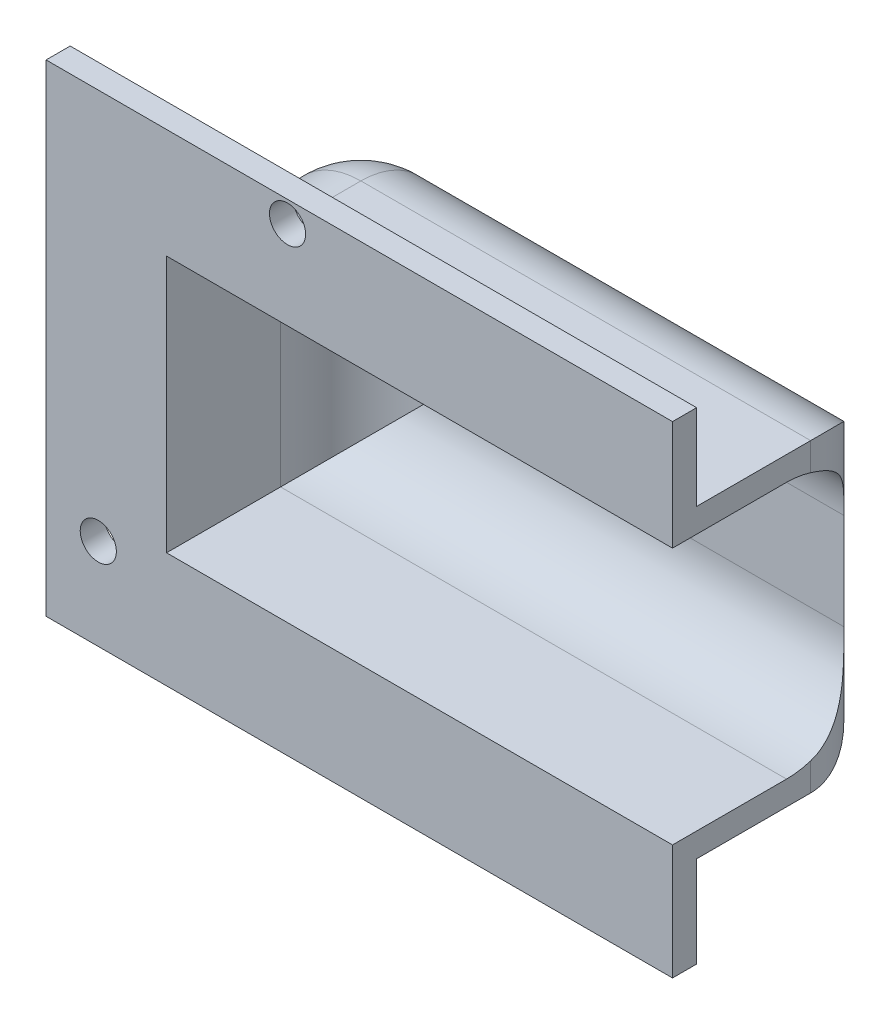
ISO-10303-21;
HEADER;
FILE_DESCRIPTION(('STEP AP214'),'2;1');
FILE_NAME('part.step','',(''),(''),'','','');
FILE_SCHEMA(('AUTOMOTIVE_DESIGN { 1 0 10303 214 1 1 1 1 }'));
ENDSEC;
DATA;
#1=APPLICATION_CONTEXT('core data for automotive mechanical design processes');
#2=APPLICATION_PROTOCOL_DEFINITION('international standard','automotive_design',2000,#1);
#3=PRODUCT_CONTEXT('',#1,'mechanical');
#4=PRODUCT('Part','Part','',(#3));
#5=PRODUCT_RELATED_PRODUCT_CATEGORY('part','',(#4));
#6=PRODUCT_DEFINITION_FORMATION('','',#4);
#7=PRODUCT_DEFINITION_CONTEXT('part definition',#1,'design');
#8=PRODUCT_DEFINITION('design','',#6,#7);
#9=PRODUCT_DEFINITION_SHAPE('','',#8);
#10=(LENGTH_UNIT() NAMED_UNIT(*) SI_UNIT(.MILLI.,.METRE.));
#11=(NAMED_UNIT(*) PLANE_ANGLE_UNIT() SI_UNIT($,.RADIAN.));
#12=(NAMED_UNIT(*) SI_UNIT($,.STERADIAN.) SOLID_ANGLE_UNIT());
#13=UNCERTAINTY_MEASURE_WITH_UNIT(LENGTH_MEASURE(1.E-05),#10,'distance_accuracy_value','');
#14=(GEOMETRIC_REPRESENTATION_CONTEXT(3) GLOBAL_UNCERTAINTY_ASSIGNED_CONTEXT((#13)) GLOBAL_UNIT_ASSIGNED_CONTEXT((#10,
#11,#12)) REPRESENTATION_CONTEXT('',''));
#15=CARTESIAN_POINT('',(0.,0.,0.));
#16=DIRECTION('',(0.,0.,1.));
#17=DIRECTION('',(1.,0.,0.));
#18=AXIS2_PLACEMENT_3D('',#15,#16,#17);
#19=CARTESIAN_POINT('',(33.,-16.,24.2));
#20=DIRECTION('',(-1.,0.,0.));
#21=DIRECTION('',(0.,-1.,0.));
#22=AXIS2_PLACEMENT_3D('',#19,#20,#21);
#23=PLANE('',#22);
#24=DIRECTION('',(0.,0.,-1.));
#25=VECTOR('',#24,1.);
#26=CARTESIAN_POINT('',(33.,-19.,24.2));
#27=LINE('',#26,#25);
#28=CARTESIAN_POINT('',(33.,-19.,21.2));
#29=VERTEX_POINT('',#28);
#30=CARTESIAN_POINT('',(33.,-19.,7.));
#31=VERTEX_POINT('',#30);
#32=EDGE_CURVE('E212',#29,#31,#27,.T.);
#33=ORIENTED_EDGE('',*,*,#32,.T.);
#34=DIRECTION('',(0.,1.,0.));
#35=VECTOR('',#34,1.);
#36=CARTESIAN_POINT('',(33.,19.,7.));
#37=LINE('',#36,#35);
#38=CARTESIAN_POINT('',(33.,-15.5393920141695,7.));
#39=VERTEX_POINT('',#38);
#40=EDGE_CURVE('E229',#31,#39,#37,.T.);
#41=ORIENTED_EDGE('',*,*,#40,.T.);
#42=CARTESIAN_POINT('',(33.,-6.,10.));
#43=DIRECTION('',(-1.,0.,0.));
#44=DIRECTION('',(0.,-1.,0.));
#45=AXIS2_PLACEMENT_3D('',#42,#43,#44);
#46=CIRCLE('',#45,10.);
#47=CARTESIAN_POINT('',(33.,-16.,10.));
#48=VERTEX_POINT('',#47);
#49=EDGE_CURVE('E388',#39,#48,#46,.T.);
#50=ORIENTED_EDGE('',*,*,#49,.T.);
#51=DIRECTION('',(0.,0.,1.));
#52=VECTOR('',#51,1.);
#53=CARTESIAN_POINT('',(33.,-16.,0.));
#54=LINE('',#53,#52);
#55=CARTESIAN_POINT('',(33.,-16.,24.2));
#56=VERTEX_POINT('',#55);
#57=EDGE_CURVE('E190',#48,#56,#54,.T.);
#58=ORIENTED_EDGE('',*,*,#57,.T.);
#59=DIRECTION('',(0.,1.,0.));
#60=VECTOR('',#59,1.);
#61=CARTESIAN_POINT('',(33.,0.,24.2));
#62=LINE('',#61,#60);
#63=CARTESIAN_POINT('',(33.,-30.3511171910625,24.2));
#64=VERTEX_POINT('',#63);
#65=EDGE_CURVE('E203',#64,#56,#62,.T.);
#66=ORIENTED_EDGE('',*,*,#65,.F.);
#67=DIRECTION('',(0.,0.,1.));
#68=VECTOR('',#67,1.);
#69=CARTESIAN_POINT('',(33.,-30.3511171910625,21.2));
#70=LINE('',#69,#68);
#71=CARTESIAN_POINT('',(33.,-30.3511171910625,21.2));
#72=VERTEX_POINT('',#71);
#73=EDGE_CURVE('E665',#72,#64,#70,.T.);
#74=ORIENTED_EDGE('',*,*,#73,.F.);
#75=DIRECTION('',(0.,1.,0.));
#76=VECTOR('',#75,1.);
#77=CARTESIAN_POINT('',(33.,0.,21.2));
#78=LINE('',#77,#76);
#79=EDGE_CURVE('E370',#72,#29,#78,.T.);
#80=ORIENTED_EDGE('',*,*,#79,.T.);
#81=EDGE_LOOP('',(#33,#41,#50,#58,#66,#74,#80));
#82=FACE_BOUND('',#81,.T.);
#83=ADVANCED_FACE('F41',(#82),#23,.F.);
#84=CARTESIAN_POINT('',(0.,0.,24.2));
#85=DIRECTION('',(0.,0.,-1.));
#86=DIRECTION('',(-1.,0.,0.));
#87=AXIS2_PLACEMENT_3D('',#84,#85,#86);
#88=PLANE('',#87);
#89=CARTESIAN_POINT('',(-14.9360679774998,27.,24.2));
#90=DIRECTION('',(0.,0.,-1.));
#91=DIRECTION('',(-1.,0.,0.));
#92=AXIS2_PLACEMENT_3D('',#89,#90,#91);
#93=CIRCLE('',#92,2.25000000000001);
#94=CARTESIAN_POINT('',(-17.1860679774998,27.,24.2));
#95=VERTEX_POINT('',#94);
#96=EDGE_CURVE('E200',#95,#95,#93,.T.);
#97=ORIENTED_EDGE('',*,*,#96,.T.);
#98=EDGE_LOOP('',(#97));
#99=FACE_BOUND('',#98,.T.);
#100=CARTESIAN_POINT('',(-38.5,-19.,24.2));
#101=DIRECTION('',(0.,0.,-1.));
#102=DIRECTION('',(-1.,0.,0.));
#103=AXIS2_PLACEMENT_3D('',#100,#101,#102);
#104=CIRCLE('',#103,2.25);
#105=CARTESIAN_POINT('',(-40.75,-19.,24.2));
#106=VERTEX_POINT('',#105);
#107=EDGE_CURVE('E244',#106,#106,#104,.T.);
#108=ORIENTED_EDGE('',*,*,#107,.T.);
#109=EDGE_LOOP('',(#108));
#110=FACE_BOUND('',#109,.T.);
#111=DIRECTION('',(-1.,0.,0.));
#112=VECTOR('',#111,1.);
#113=CARTESIAN_POINT('',(-30.,16.,24.2));
#114=LINE('',#113,#112);
#115=CARTESIAN_POINT('',(33.,16.,24.2));
#116=VERTEX_POINT('',#115);
#117=CARTESIAN_POINT('',(-30.,16.,24.2));
#118=VERTEX_POINT('',#117);
#119=EDGE_CURVE('E178',#116,#118,#114,.T.);
#120=ORIENTED_EDGE('',*,*,#119,.F.);
#121=CARTESIAN_POINT('',(33.,29.6488828089375,24.2));
#122=VERTEX_POINT('',#121);
#123=EDGE_CURVE('E195',#116,#122,#62,.T.);
#124=ORIENTED_EDGE('',*,*,#123,.T.);
#125=DIRECTION('',(-1.,0.,0.));
#126=VECTOR('',#125,1.);
#127=CARTESIAN_POINT('',(0.,29.6488828089375,24.2));
#128=LINE('',#127,#126);
#129=CARTESIAN_POINT('',(-45.,29.6488828089375,24.2));
#130=VERTEX_POINT('',#129);
#131=EDGE_CURVE('E673',#122,#130,#128,.T.);
#132=ORIENTED_EDGE('',*,*,#131,.T.);
#133=DIRECTION('',(0.,-1.,0.));
#134=VECTOR('',#133,1.);
#135=CARTESIAN_POINT('',(-45.,0.,24.2));
#136=LINE('',#135,#134);
#137=CARTESIAN_POINT('',(-45.,-30.3511171910625,24.2));
#138=VERTEX_POINT('',#137);
#139=EDGE_CURVE('E675',#130,#138,#136,.T.);
#140=ORIENTED_EDGE('',*,*,#139,.T.);
#141=DIRECTION('',(1.,0.,0.));
#142=VECTOR('',#141,1.);
#143=CARTESIAN_POINT('',(0.,-30.3511171910625,24.2));
#144=LINE('',#143,#142);
#145=EDGE_CURVE('E667',#138,#64,#144,.T.);
#146=ORIENTED_EDGE('',*,*,#145,.T.);
#147=ORIENTED_EDGE('',*,*,#65,.T.);
#148=DIRECTION('',(1.,0.,0.));
#149=VECTOR('',#148,1.);
#150=CARTESIAN_POINT('',(30.,-16.,24.2));
#151=LINE('',#150,#149);
#152=CARTESIAN_POINT('',(-30.,-16.,24.2));
#153=VERTEX_POINT('',#152);
#154=EDGE_CURVE('E659',#153,#56,#151,.T.);
#155=ORIENTED_EDGE('',*,*,#154,.F.);
#156=DIRECTION('',(0.,-1.,0.));
#157=VECTOR('',#156,1.);
#158=CARTESIAN_POINT('',(-30.,-16.,24.2));
#159=LINE('',#158,#157);
#160=EDGE_CURVE('E197',#118,#153,#159,.T.);
#161=ORIENTED_EDGE('',*,*,#160,.F.);
#162=EDGE_LOOP('',(#120,#124,#132,#140,#146,#147,#155,#161));
#163=FACE_BOUND('',#162,.T.);
#164=ADVANCED_FACE('F188',(#99,#110,#163),#88,.F.);
#165=CARTESIAN_POINT('',(30.,19.,24.2));
#166=DIRECTION('',(0.,-1.,0.));
#167=DIRECTION('',(0.,0.,-1.));
#168=AXIS2_PLACEMENT_3D('',#165,#166,#167);
#169=PLANE('',#168);
#170=DIRECTION('',(-1.,0.,0.));
#171=VECTOR('',#170,1.);
#172=CARTESIAN_POINT('',(-33.,19.,7.));
#173=LINE('',#172,#171);
#174=CARTESIAN_POINT('',(33.,19.,7.));
#175=VERTEX_POINT('',#174);
#176=CARTESIAN_POINT('',(-23.,19.,7.));
#177=VERTEX_POINT('',#176);
#178=EDGE_CURVE('E232',#175,#177,#173,.T.);
#179=ORIENTED_EDGE('',*,*,#178,.T.);
#180=DIRECTION('',(0.,0.,-1.));
#181=VECTOR('',#180,1.);
#182=CARTESIAN_POINT('',(-23.,19.,24.2));
#183=LINE('',#182,#181);
#184=CARTESIAN_POINT('',(-23.,19.,21.2));
#185=VERTEX_POINT('',#184);
#186=EDGE_CURVE('E61',#177,#185,#183,.F.);
#187=ORIENTED_EDGE('',*,*,#186,.T.);
#188=DIRECTION('',(-1.,0.,0.));
#189=VECTOR('',#188,1.);
#190=CARTESIAN_POINT('',(30.,19.,21.2));
#191=LINE('',#190,#189);
#192=CARTESIAN_POINT('',(33.,19.,21.2));
#193=VERTEX_POINT('',#192);
#194=EDGE_CURVE('E429',#193,#185,#191,.T.);
#195=ORIENTED_EDGE('',*,*,#194,.F.);
#196=DIRECTION('',(0.,0.,-1.));
#197=VECTOR('',#196,1.);
#198=CARTESIAN_POINT('',(33.,19.,24.2));
#199=LINE('',#198,#197);
#200=EDGE_CURVE('E210',#193,#175,#199,.T.);
#201=ORIENTED_EDGE('',*,*,#200,.T.);
#202=EDGE_LOOP('',(#179,#187,#195,#201));
#203=FACE_BOUND('',#202,.T.);
#204=ADVANCED_FACE('F315',(#203),#169,.F.);
#205=CARTESIAN_POINT('',(-33.,-16.,24.2));
#206=DIRECTION('',(1.,0.,0.));
#207=DIRECTION('',(0.,1.,0.));
#208=AXIS2_PLACEMENT_3D('',#205,#206,#207);
#209=PLANE('',#208);
#210=DIRECTION('',(0.,-1.,0.));
#211=VECTOR('',#210,1.);
#212=CARTESIAN_POINT('',(-33.,-16.,21.2));
#213=LINE('',#212,#211);
#214=CARTESIAN_POINT('',(-33.,9.,21.2));
#215=VERTEX_POINT('',#214);
#216=CARTESIAN_POINT('',(-33.,-9.,21.2));
#217=VERTEX_POINT('',#216);
#218=EDGE_CURVE('E649',#215,#217,#213,.T.);
#219=ORIENTED_EDGE('',*,*,#218,.F.);
#220=DIRECTION('',(0.,0.,-1.));
#221=VECTOR('',#220,1.);
#222=CARTESIAN_POINT('',(-33.,9.,24.2));
#223=LINE('',#222,#221);
#224=CARTESIAN_POINT('',(-33.,9.,7.));
#225=VERTEX_POINT('',#224);
#226=EDGE_CURVE('E402',#215,#225,#223,.T.);
#227=ORIENTED_EDGE('',*,*,#226,.T.);
#228=DIRECTION('',(0.,-1.,0.));
#229=VECTOR('',#228,1.);
#230=CARTESIAN_POINT('',(-33.,-19.,7.));
#231=LINE('',#230,#229);
#232=CARTESIAN_POINT('',(-33.,-9.,7.));
#233=VERTEX_POINT('',#232);
#234=EDGE_CURVE('E214',#225,#233,#231,.T.);
#235=ORIENTED_EDGE('',*,*,#234,.T.);
#236=DIRECTION('',(0.,0.,-1.));
#237=VECTOR('',#236,1.);
#238=CARTESIAN_POINT('',(-33.,-9.,24.2));
#239=LINE('',#238,#237);
#240=EDGE_CURVE('E397',#233,#217,#239,.F.);
#241=ORIENTED_EDGE('',*,*,#240,.T.);
#242=EDGE_LOOP('',(#219,#227,#235,#241));
#243=FACE_BOUND('',#242,.T.);
#244=ADVANCED_FACE('F308',(#243),#209,.F.);
#245=CARTESIAN_POINT('',(30.,-19.,24.2));
#246=DIRECTION('',(0.,1.,0.));
#247=DIRECTION('',(0.,0.,1.));
#248=AXIS2_PLACEMENT_3D('',#245,#246,#247);
#249=PLANE('',#248);
#250=DIRECTION('',(1.,0.,0.));
#251=VECTOR('',#250,1.);
#252=CARTESIAN_POINT('',(30.,-19.,21.2));
#253=LINE('',#252,#251);
#254=CARTESIAN_POINT('',(-23.,-19.,21.2));
#255=VERTEX_POINT('',#254);
#256=EDGE_CURVE('E646',#255,#29,#253,.T.);
#257=ORIENTED_EDGE('',*,*,#256,.F.);
#258=DIRECTION('',(0.,0.,-1.));
#259=VECTOR('',#258,1.);
#260=CARTESIAN_POINT('',(-23.,-19.,24.2));
#261=LINE('',#260,#259);
#262=CARTESIAN_POINT('',(-23.,-19.,7.));
#263=VERTEX_POINT('',#262);
#264=EDGE_CURVE('E404',#255,#263,#261,.T.);
#265=ORIENTED_EDGE('',*,*,#264,.T.);
#266=DIRECTION('',(1.,0.,0.));
#267=VECTOR('',#266,1.);
#268=CARTESIAN_POINT('',(33.,-19.,7.));
#269=LINE('',#268,#267);
#270=EDGE_CURVE('E228',#263,#31,#269,.T.);
#271=ORIENTED_EDGE('',*,*,#270,.T.);
#272=ORIENTED_EDGE('',*,*,#32,.F.);
#273=EDGE_LOOP('',(#257,#265,#271,#272));
#274=FACE_BOUND('',#273,.T.);
#275=ADVANCED_FACE('F304',(#274),#249,.F.);
#276=CARTESIAN_POINT('',(30.,16.,24.2));
#277=DIRECTION('',(0.,-1.,0.));
#278=DIRECTION('',(0.,0.,-1.));
#279=AXIS2_PLACEMENT_3D('',#276,#277,#278);
#280=PLANE('',#279);
#281=DIRECTION('',(0.,0.,-1.));
#282=VECTOR('',#281,1.);
#283=CARTESIAN_POINT('',(-30.,16.,24.2));
#284=LINE('',#283,#282);
#285=CARTESIAN_POINT('',(-30.,16.,10.));
#286=VERTEX_POINT('',#285);
#287=EDGE_CURVE('E202',#118,#286,#284,.T.);
#288=ORIENTED_EDGE('',*,*,#287,.T.);
#289=DIRECTION('',(-1.,0.,0.));
#290=VECTOR('',#289,1.);
#291=CARTESIAN_POINT('',(30.,16.,10.));
#292=LINE('',#291,#290);
#293=CARTESIAN_POINT('',(33.,16.,10.));
#294=VERTEX_POINT('',#293);
#295=EDGE_CURVE('E181',#286,#294,#292,.F.);
#296=ORIENTED_EDGE('',*,*,#295,.T.);
#297=DIRECTION('',(0.,0.,1.));
#298=VECTOR('',#297,1.);
#299=CARTESIAN_POINT('',(33.,16.,0.));
#300=LINE('',#299,#298);
#301=EDGE_CURVE('E172',#294,#116,#300,.T.);
#302=ORIENTED_EDGE('',*,*,#301,.T.);
#303=ORIENTED_EDGE('',*,*,#119,.T.);
#304=EDGE_LOOP('',(#288,#296,#302,#303));
#305=FACE_BOUND('',#304,.T.);
#306=ADVANCED_FACE('F180',(#305),#280,.T.);
#307=CARTESIAN_POINT('',(-30.,-16.,24.2));
#308=DIRECTION('',(1.,0.,0.));
#309=DIRECTION('',(0.,1.,0.));
#310=AXIS2_PLACEMENT_3D('',#307,#308,#309);
#311=PLANE('',#310);
#312=DIRECTION('',(0.,0.,-1.));
#313=VECTOR('',#312,1.);
#314=CARTESIAN_POINT('',(-30.,-16.,24.2));
#315=LINE('',#314,#313);
#316=CARTESIAN_POINT('',(-30.,-16.,10.));
#317=VERTEX_POINT('',#316);
#318=EDGE_CURVE('E187',#153,#317,#315,.T.);
#319=ORIENTED_EDGE('',*,*,#318,.T.);
#320=DIRECTION('',(0.,-1.,0.));
#321=VECTOR('',#320,1.);
#322=CARTESIAN_POINT('',(-30.,-16.,10.));
#323=LINE('',#322,#321);
#324=EDGE_CURVE('E254',#317,#286,#323,.F.);
#325=ORIENTED_EDGE('',*,*,#324,.T.);
#326=ORIENTED_EDGE('',*,*,#287,.F.);
#327=ORIENTED_EDGE('',*,*,#160,.T.);
#328=EDGE_LOOP('',(#319,#325,#326,#327));
#329=FACE_BOUND('',#328,.T.);
#330=ADVANCED_FACE('F322',(#329),#311,.T.);
#331=CARTESIAN_POINT('',(30.,-16.,24.2));
#332=DIRECTION('',(0.,1.,0.));
#333=DIRECTION('',(0.,0.,1.));
#334=AXIS2_PLACEMENT_3D('',#331,#332,#333);
#335=PLANE('',#334);
#336=ORIENTED_EDGE('',*,*,#57,.F.);
#337=DIRECTION('',(1.,0.,0.));
#338=VECTOR('',#337,1.);
#339=CARTESIAN_POINT('',(30.,-16.,10.));
#340=LINE('',#339,#338);
#341=EDGE_CURVE('E253',#48,#317,#340,.F.);
#342=ORIENTED_EDGE('',*,*,#341,.T.);
#343=ORIENTED_EDGE('',*,*,#318,.F.);
#344=ORIENTED_EDGE('',*,*,#154,.T.);
#345=EDGE_LOOP('',(#336,#342,#343,#344));
#346=FACE_BOUND('',#345,.T.);
#347=ADVANCED_FACE('F302',(#346),#335,.T.);
#348=ORIENTED_EDGE('',*,*,#301,.F.);
#349=CARTESIAN_POINT('',(33.,6.,10.));
#350=DIRECTION('',(-1.,0.,0.));
#351=DIRECTION('',(0.,-1.,0.));
#352=AXIS2_PLACEMENT_3D('',#349,#350,#351);
#353=CIRCLE('',#352,10.);
#354=CARTESIAN_POINT('',(33.,15.5393920141695,7.));
#355=VERTEX_POINT('',#354);
#356=EDGE_CURVE('E260',#294,#355,#353,.T.);
#357=ORIENTED_EDGE('',*,*,#356,.T.);
#358=DIRECTION('',(0.,1.,0.));
#359=VECTOR('',#358,1.);
#360=CARTESIAN_POINT('',(33.,19.,7.));
#361=LINE('',#360,#359);
#362=EDGE_CURVE('E226',#355,#175,#361,.T.);
#363=ORIENTED_EDGE('',*,*,#362,.T.);
#364=ORIENTED_EDGE('',*,*,#200,.F.);
#365=CARTESIAN_POINT('',(33.,29.6488828089375,21.2));
#366=VERTEX_POINT('',#365);
#367=EDGE_CURVE('E689',#193,#366,#78,.T.);
#368=ORIENTED_EDGE('',*,*,#367,.T.);
#369=DIRECTION('',(0.,0.,1.));
#370=VECTOR('',#369,1.);
#371=CARTESIAN_POINT('',(33.,29.6488828089375,21.2));
#372=LINE('',#371,#370);
#373=EDGE_CURVE('E201',#366,#122,#372,.T.);
#374=ORIENTED_EDGE('',*,*,#373,.T.);
#375=ORIENTED_EDGE('',*,*,#123,.F.);
#376=EDGE_LOOP('',(#348,#357,#363,#364,#368,#374,#375));
#377=FACE_BOUND('',#376,.T.);
#378=ADVANCED_FACE('F196',(#377),#23,.F.);
#379=CARTESIAN_POINT('',(0.,0.,-3.));
#380=DIRECTION('',(0.,0.,-1.));
#381=DIRECTION('',(-1.,0.,0.));
#382=AXIS2_PLACEMENT_3D('',#379,#380,#381);
#383=PLANE('',#382);
#384=DIRECTION('',(1.,0.,0.));
#385=VECTOR('',#384,1.);
#386=CARTESIAN_POINT('',(-33.,-9.,-3.));
#387=LINE('',#386,#385);
#388=CARTESIAN_POINT('',(23.,-9.,-3.));
#389=VERTEX_POINT('',#388);
#390=CARTESIAN_POINT('',(-23.,-9.,-3.));
#391=VERTEX_POINT('',#390);
#392=EDGE_CURVE('E219',#389,#391,#387,.F.);
#393=ORIENTED_EDGE('',*,*,#392,.T.);
#394=DIRECTION('',(0.,-1.,0.));
#395=VECTOR('',#394,1.);
#396=CARTESIAN_POINT('',(-23.,19.,-3.));
#397=LINE('',#396,#395);
#398=CARTESIAN_POINT('',(-23.,9.,-3.));
#399=VERTEX_POINT('',#398);
#400=EDGE_CURVE('E223',#391,#399,#397,.F.);
#401=ORIENTED_EDGE('',*,*,#400,.T.);
#402=DIRECTION('',(-1.,0.,0.));
#403=VECTOR('',#402,1.);
#404=CARTESIAN_POINT('',(33.,9.,-3.));
#405=LINE('',#404,#403);
#406=CARTESIAN_POINT('',(23.,9.,-3.));
#407=VERTEX_POINT('',#406);
#408=EDGE_CURVE('E216',#399,#407,#405,.F.);
#409=ORIENTED_EDGE('',*,*,#408,.T.);
#410=DIRECTION('',(0.,1.,0.));
#411=VECTOR('',#410,1.);
#412=CARTESIAN_POINT('',(23.,-19.,-3.));
#413=LINE('',#412,#411);
#414=EDGE_CURVE('E218',#407,#389,#413,.F.);
#415=ORIENTED_EDGE('',*,*,#414,.T.);
#416=EDGE_LOOP('',(#393,#401,#409,#415));
#417=FACE_BOUND('',#416,.T.);
#418=ADVANCED_FACE('F300',(#417),#383,.T.);
#419=CARTESIAN_POINT('',(0.,0.,0.));
#420=DIRECTION('',(0.,0.,-1.));
#421=DIRECTION('',(-1.,0.,0.));
#422=AXIS2_PLACEMENT_3D('',#419,#420,#421);
#423=PLANE('',#422);
#424=DIRECTION('',(0.,-1.,0.));
#425=VECTOR('',#424,1.);
#426=CARTESIAN_POINT('',(30.1414284285429,-16.,0.));
#427=LINE('',#426,#425);
#428=CARTESIAN_POINT('',(30.1414284285429,-6.,0.));
#429=VERTEX_POINT('',#428);
#430=CARTESIAN_POINT('',(30.1414284285429,6.,0.));
#431=VERTEX_POINT('',#430);
#432=EDGE_CURVE('E235',#429,#431,#427,.F.);
#433=ORIENTED_EDGE('',*,*,#432,.T.);
#434=DIRECTION('',(-1.,0.,0.));
#435=VECTOR('',#434,1.);
#436=CARTESIAN_POINT('',(0.,6.,0.));
#437=LINE('',#436,#435);
#438=CARTESIAN_POINT('',(-20.,6.,0.));
#439=VERTEX_POINT('',#438);
#440=EDGE_CURVE('E248',#431,#439,#437,.T.);
#441=ORIENTED_EDGE('',*,*,#440,.T.);
#442=DIRECTION('',(0.,-1.,0.));
#443=VECTOR('',#442,1.);
#444=CARTESIAN_POINT('',(-20.,0.,0.));
#445=LINE('',#444,#443);
#446=CARTESIAN_POINT('',(-20.,-6.,0.));
#447=VERTEX_POINT('',#446);
#448=EDGE_CURVE('E250',#439,#447,#445,.T.);
#449=ORIENTED_EDGE('',*,*,#448,.T.);
#450=DIRECTION('',(1.,0.,0.));
#451=VECTOR('',#450,1.);
#452=CARTESIAN_POINT('',(0.,-6.,0.));
#453=LINE('',#452,#451);
#454=EDGE_CURVE('E240',#447,#429,#453,.T.);
#455=ORIENTED_EDGE('',*,*,#454,.T.);
#456=EDGE_LOOP('',(#433,#441,#449,#455));
#457=FACE_BOUND('',#456,.T.);
#458=ADVANCED_FACE('F297',(#457),#423,.F.);
#459=CARTESIAN_POINT('',(0.,0.,21.2));
#460=DIRECTION('',(0.,0.,1.));
#461=DIRECTION('',(1.,0.,0.));
#462=AXIS2_PLACEMENT_3D('',#459,#460,#461);
#463=PLANE('',#462);
#464=CARTESIAN_POINT('',(-14.9360679774998,27.,21.2));
#465=DIRECTION('',(0.,0.,-1.));
#466=DIRECTION('',(-1.,0.,0.));
#467=AXIS2_PLACEMENT_3D('',#464,#465,#466);
#468=CIRCLE('',#467,2.25000000000001);
#469=CARTESIAN_POINT('',(-17.1860679774998,27.,21.2));
#470=VERTEX_POINT('',#469);
#471=EDGE_CURVE('E697',#470,#470,#468,.T.);
#472=ORIENTED_EDGE('',*,*,#471,.F.);
#473=EDGE_LOOP('',(#472));
#474=FACE_BOUND('',#473,.T.);
#475=CARTESIAN_POINT('',(-38.5,-19.,21.2));
#476=DIRECTION('',(0.,0.,-1.));
#477=DIRECTION('',(-1.,0.,0.));
#478=AXIS2_PLACEMENT_3D('',#475,#476,#477);
#479=CIRCLE('',#478,2.25);
#480=CARTESIAN_POINT('',(-40.75,-19.,21.2));
#481=VERTEX_POINT('',#480);
#482=EDGE_CURVE('E696',#481,#481,#479,.T.);
#483=ORIENTED_EDGE('',*,*,#482,.F.);
#484=EDGE_LOOP('',(#483));
#485=FACE_BOUND('',#484,.T.);
#486=ORIENTED_EDGE('',*,*,#367,.F.);
#487=ORIENTED_EDGE('',*,*,#194,.T.);
#488=CARTESIAN_POINT('',(-23.,9.,21.2));
#489=DIRECTION('',(0.,0.,1.));
#490=DIRECTION('',(1.,0.,0.));
#491=AXIS2_PLACEMENT_3D('',#488,#489,#490);
#492=CIRCLE('',#491,10.);
#493=EDGE_CURVE('E49',#185,#215,#492,.T.);
#494=ORIENTED_EDGE('',*,*,#493,.T.);
#495=ORIENTED_EDGE('',*,*,#218,.T.);
#496=CARTESIAN_POINT('',(-23.,-9.,21.2));
#497=DIRECTION('',(0.,0.,1.));
#498=DIRECTION('',(1.,0.,0.));
#499=AXIS2_PLACEMENT_3D('',#496,#497,#498);
#500=CIRCLE('',#499,10.);
#501=EDGE_CURVE('E11',#217,#255,#500,.T.);
#502=ORIENTED_EDGE('',*,*,#501,.T.);
#503=ORIENTED_EDGE('',*,*,#256,.T.);
#504=ORIENTED_EDGE('',*,*,#79,.F.);
#505=DIRECTION('',(1.,0.,0.));
#506=VECTOR('',#505,1.);
#507=CARTESIAN_POINT('',(0.,-30.3511171910625,21.2));
#508=LINE('',#507,#506);
#509=CARTESIAN_POINT('',(-45.,-30.3511171910625,21.2));
#510=VERTEX_POINT('',#509);
#511=EDGE_CURVE('E666',#510,#72,#508,.T.);
#512=ORIENTED_EDGE('',*,*,#511,.F.);
#513=DIRECTION('',(0.,-1.,0.));
#514=VECTOR('',#513,1.);
#515=CARTESIAN_POINT('',(-45.,0.,21.2));
#516=LINE('',#515,#514);
#517=CARTESIAN_POINT('',(-45.,29.6488828089375,21.2));
#518=VERTEX_POINT('',#517);
#519=EDGE_CURVE('E668',#518,#510,#516,.T.);
#520=ORIENTED_EDGE('',*,*,#519,.F.);
#521=DIRECTION('',(-1.,0.,0.));
#522=VECTOR('',#521,1.);
#523=CARTESIAN_POINT('',(0.,29.6488828089375,21.2));
#524=LINE('',#523,#522);
#525=EDGE_CURVE('E688',#366,#518,#524,.T.);
#526=ORIENTED_EDGE('',*,*,#525,.F.);
#527=EDGE_LOOP('',(#486,#487,#494,#495,#502,#503,#504,#512,#520,#526));
#528=FACE_BOUND('',#527,.T.);
#529=ADVANCED_FACE('F328',(#474,#485,#528),#463,.F.);
#530=CARTESIAN_POINT('',(0.,-30.3511171910625,21.2));
#531=DIRECTION('',(0.,-1.,0.));
#532=DIRECTION('',(0.,0.,-1.));
#533=AXIS2_PLACEMENT_3D('',#530,#531,#532);
#534=PLANE('',#533);
#535=ORIENTED_EDGE('',*,*,#145,.F.);
#536=DIRECTION('',(0.,0.,1.));
#537=VECTOR('',#536,1.);
#538=CARTESIAN_POINT('',(-45.,-30.3511171910625,21.2));
#539=LINE('',#538,#537);
#540=EDGE_CURVE('E655',#510,#138,#539,.T.);
#541=ORIENTED_EDGE('',*,*,#540,.F.);
#542=ORIENTED_EDGE('',*,*,#511,.T.);
#543=ORIENTED_EDGE('',*,*,#73,.T.);
#544=EDGE_LOOP('',(#535,#541,#542,#543));
#545=FACE_BOUND('',#544,.T.);
#546=ADVANCED_FACE('F335',(#545),#534,.T.);
#547=CARTESIAN_POINT('',(-45.,0.,21.2));
#548=DIRECTION('',(-1.,0.,0.));
#549=DIRECTION('',(0.,0.,1.));
#550=AXIS2_PLACEMENT_3D('',#547,#548,#549);
#551=PLANE('',#550);
#552=ORIENTED_EDGE('',*,*,#139,.F.);
#553=DIRECTION('',(0.,0.,1.));
#554=VECTOR('',#553,1.);
#555=CARTESIAN_POINT('',(-45.,29.6488828089375,21.2));
#556=LINE('',#555,#554);
#557=EDGE_CURVE('E682',#518,#130,#556,.T.);
#558=ORIENTED_EDGE('',*,*,#557,.F.);
#559=ORIENTED_EDGE('',*,*,#519,.T.);
#560=ORIENTED_EDGE('',*,*,#540,.T.);
#561=EDGE_LOOP('',(#552,#558,#559,#560));
#562=FACE_BOUND('',#561,.T.);
#563=ADVANCED_FACE('F334',(#562),#551,.T.);
#564=CARTESIAN_POINT('',(0.,29.6488828089375,21.2));
#565=DIRECTION('',(0.,1.,0.));
#566=DIRECTION('',(0.,0.,1.));
#567=AXIS2_PLACEMENT_3D('',#564,#565,#566);
#568=PLANE('',#567);
#569=ORIENTED_EDGE('',*,*,#131,.F.);
#570=ORIENTED_EDGE('',*,*,#373,.F.);
#571=ORIENTED_EDGE('',*,*,#525,.T.);
#572=ORIENTED_EDGE('',*,*,#557,.T.);
#573=EDGE_LOOP('',(#569,#570,#571,#572));
#574=FACE_BOUND('',#573,.T.);
#575=ADVANCED_FACE('F340',(#574),#568,.T.);
#576=CARTESIAN_POINT('',(-38.5,-19.,24.2));
#577=DIRECTION('',(0.,0.,-1.));
#578=DIRECTION('',(-1.,0.,0.));
#579=AXIS2_PLACEMENT_3D('',#576,#577,#578);
#580=CYLINDRICAL_SURFACE('',#579,2.25);
#581=ORIENTED_EDGE('',*,*,#107,.F.);
#582=EDGE_LOOP('',(#581));
#583=FACE_BOUND('',#582,.T.);
#584=ORIENTED_EDGE('',*,*,#482,.T.);
#585=EDGE_LOOP('',(#584));
#586=FACE_BOUND('',#585,.T.);
#587=ADVANCED_FACE('F338',(#583,#586),#580,.F.);
#588=CARTESIAN_POINT('',(-14.9360679774998,27.,24.2));
#589=DIRECTION('',(0.,0.,-1.));
#590=DIRECTION('',(-1.,0.,0.));
#591=AXIS2_PLACEMENT_3D('',#588,#589,#590);
#592=CYLINDRICAL_SURFACE('',#591,2.25000000000001);
#593=ORIENTED_EDGE('',*,*,#96,.F.);
#594=EDGE_LOOP('',(#593));
#595=FACE_BOUND('',#594,.T.);
#596=ORIENTED_EDGE('',*,*,#471,.T.);
#597=EDGE_LOOP('',(#596));
#598=FACE_BOUND('',#597,.T.);
#599=ADVANCED_FACE('F285',(#595,#598),#592,.F.);
#600=CARTESIAN_POINT('',(23.,-16.,7.));
#601=DIRECTION('',(0.,-1.,0.));
#602=DIRECTION('',(1.,0.,0.));
#603=AXIS2_PLACEMENT_3D('',#600,#601,#602);
#604=CYLINDRICAL_SURFACE('',#603,10.);
#605=CARTESIAN_POINT('',(23.,-9.,7.));
#606=DIRECTION('',(-0.707106781186547,-0.707106781186547,0.));
#607=DIRECTION('',(0.707106781186547,-0.707106781186548,0.));
#608=AXIS2_PLACEMENT_3D('',#605,#606,#607);
#609=ELLIPSE('',#608,14.1421356237309,10.);
#610=EDGE_CURVE('E238',#389,#31,#609,.T.);
#611=ORIENTED_EDGE('',*,*,#610,.F.);
#612=ORIENTED_EDGE('',*,*,#414,.F.);
#613=CARTESIAN_POINT('',(23.,9.,7.));
#614=DIRECTION('',(0.707106781186547,-0.707106781186548,0.));
#615=DIRECTION('',(0.707106781186547,0.707106781186547,0.));
#616=AXIS2_PLACEMENT_3D('',#613,#614,#615);
#617=ELLIPSE('',#616,14.142135623731,10.);
#618=EDGE_CURVE('E241',#175,#407,#617,.F.);
#619=ORIENTED_EDGE('',*,*,#618,.F.);
#620=ORIENTED_EDGE('',*,*,#362,.F.);
#621=CARTESIAN_POINT('',(33.,15.5393920141695,7.));
#622=CARTESIAN_POINT('',(33.0000018674129,15.5019622285289,6.88097400660161));
#623=CARTESIAN_POINT('',(32.9978744574274,15.4623077183372,6.76267361557732));
#624=CARTESIAN_POINT('',(32.9895352669323,15.3786588431697,6.52778250798243));
#625=CARTESIAN_POINT('',(32.9833241101912,15.3346651418523,6.41119153308843));
#626=CARTESIAN_POINT('',(32.9588511355277,15.1964678481354,6.06468325903141));
#627=CARTESIAN_POINT('',(32.9347486955695,15.0959285419403,5.83765116822263));
#628=CARTESIAN_POINT('',(32.8729185966897,14.8801560500713,5.39534323875126));
#629=CARTESIAN_POINT('',(32.8353192262202,14.7650676121401,5.17997797664148));
#630=CARTESIAN_POINT('',(32.7482416762657,14.5206217303942,4.7599552262842));
#631=CARTESIAN_POINT('',(32.6987597693938,14.3912598160841,4.55530112256189));
#632=CARTESIAN_POINT('',(32.5900686637977,14.1201814879484,4.15876481406069));
#633=CARTESIAN_POINT('',(32.5309126019273,13.9785344441782,3.96682046820272));
#634=CARTESIAN_POINT('',(32.4045645535639,13.683407477374,3.59519033576922));
#635=CARTESIAN_POINT('',(32.3373731613917,13.5299284297739,3.41550364411709));
#636=CARTESIAN_POINT('',(32.1260238618057,13.0521210822061,2.89436738596899));
#637=CARTESIAN_POINT('',(31.972354749421,12.7110480904718,2.57174888953198));
#638=CARTESIAN_POINT('',(31.7225513738603,12.1442120946979,2.10567019030119));
#639=CARTESIAN_POINT('',(31.6297674099967,11.931158844519,1.94440072906422));
#640=CARTESIAN_POINT('',(31.4436933397152,11.4928871027741,1.63941292404505));
#641=CARTESIAN_POINT('',(31.3504031510964,11.2676665788642,1.49569752553637));
#642=CARTESIAN_POINT('',(31.1664971804807,10.8056981934347,1.2263592475068));
#643=CARTESIAN_POINT('',(31.0758808542415,10.5689527040856,1.10073266567772));
#644=CARTESIAN_POINT('',(30.9007383071403,10.0843139452087,0.868155989863588));
#645=CARTESIAN_POINT('',(30.816210480704,9.83642364284815,0.76120096140708));
#646=CARTESIAN_POINT('',(30.6725356697024,9.37932414667673,0.585762493742085));
#647=CARTESIAN_POINT('',(30.6116509417674,9.17197785563823,0.513842936109936));
#648=CARTESIAN_POINT('',(30.4984196980836,8.75082020933015,0.383265579074489));
#649=CARTESIAN_POINT('',(30.4460735172991,8.53700860081829,0.324608299910839));
#650=CARTESIAN_POINT('',(30.3522506451605,8.1043950511302,0.221410804243312));
#651=CARTESIAN_POINT('',(30.3107395943084,7.88561133678042,0.176825866181341));
#652=CARTESIAN_POINT('',(30.2403909421616,7.44364420938406,0.102219350723853));
#653=CARTESIAN_POINT('',(30.2115459206144,7.22046345259144,0.0721892454682271));
#654=CARTESIAN_POINT('',(30.1738700746776,6.83101511127951,0.0332123560880388));
#655=CARTESIAN_POINT('',(30.1617561519239,6.66540371381774,0.0207819120665862));
#656=CARTESIAN_POINT('',(30.1455101507953,6.33320681342614,0.00416421572000859));
#657=CARTESIAN_POINT('',(30.1413864262575,6.16662047344074,-1.44093280705428E-05));
#658=CARTESIAN_POINT('',(30.1414284285429,6.,0.));
#659=B_SPLINE_CURVE_WITH_KNOTS('',3,(#621,#622,#623,#624,#625,#626,#627,#628,#629,#630,#631,
#632,#633,#634,#635,#636,#637,#638,#639,#640,#641,#642,#643,#644,#645,#646,#647,#648,#649,#650,
#651,#652,#653,#654,#655,#656,#657,#658),.UNSPECIFIED.,.F.,.F.,(4,2,2,2,2,2,2,2,2,2,2,2,2,2,2,2,
2,2,4),(0.,0.37423144004577,0.748405731697056,1.49556607298181,2.23580493795309,
2.97627630961292,3.71280929760597,4.44928784272441,5.92561219411928,6.77356814934233,
7.62166618230534,8.46959038426249,9.31729015857685,9.99998578075474,10.6827081784022,
11.3632385304728,12.0433696677565,12.5425450782346,13.0422421009004),.UNSPECIFIED.);
#660=EDGE_CURVE('E256',#355,#431,#659,.T.);
#661=ORIENTED_EDGE('',*,*,#660,.T.);
#662=ORIENTED_EDGE('',*,*,#432,.F.);
#663=CARTESIAN_POINT('',(30.1414284285429,-6.,0.));
#664=CARTESIAN_POINT('',(30.1414188855699,-6.12380713947328,-2.50430333707029E-06));
#665=CARTESIAN_POINT('',(30.143683556362,-6.24759101973631,0.00229992893851788));
#666=CARTESIAN_POINT('',(30.1526709462674,-6.4948076421059,0.0114837150561428));
#667=CARTESIAN_POINT('',(30.1593929616954,-6.61824043655017,0.0183643451680749));
#668=CARTESIAN_POINT('',(30.1860716686155,-6.98707595361204,0.0457881986418733));
#669=CARTESIAN_POINT('',(30.2125418073376,-7.23155931501941,0.073113684938936));
#670=CARTESIAN_POINT('',(30.2807037530918,-7.71278551094881,0.144802497549917));
#671=CARTESIAN_POINT('',(30.3222145438241,-7.94958535248694,0.188963522493095));
#672=CARTESIAN_POINT('',(30.4181047175159,-8.41698438260849,0.293529752435292));
#673=CARTESIAN_POINT('',(30.4724899169294,-8.64758071595246,0.353942301302751));
#674=CARTESIAN_POINT('',(30.5910042544634,-9.0997603810988,0.489646942562682));
#675=CARTESIAN_POINT('',(30.6550586202472,-9.32139761635815,0.56482608311238));
#676=CARTESIAN_POINT('',(30.7905996228385,-9.7568405811518,0.729598704618035));
#677=CARTESIAN_POINT('',(30.8620855314632,-9.97064707521364,0.81919077378701));
#678=CARTESIAN_POINT('',(31.0103520433752,-10.3909055538955,1.01258315864672));
#679=CARTESIAN_POINT('',(31.087151904649,-10.5973261815277,1.11643665725378));
#680=CARTESIAN_POINT('',(31.24355963649,-11.0017004099906,1.33766101493347));
#681=CARTESIAN_POINT('',(31.3231678695008,-11.1996529105909,1.45503362321987));
#682=CARTESIAN_POINT('',(31.4986074580293,-11.6242805697638,1.72698656798998));
#683=CARTESIAN_POINT('',(31.594596994697,-11.8491008508358,1.88437174664067));
#684=CARTESIAN_POINT('',(31.7843858337626,-12.285671895824,2.21760037605759));
#685=CARTESIAN_POINT('',(31.878184769837,-12.4974204834173,2.39344688738345));
#686=CARTESIAN_POINT('',(32.0604073137478,-12.9067385075151,2.76308580107515));
#687=CARTESIAN_POINT('',(32.1488360734055,-13.1043215675147,2.95686053887865));
#688=CARTESIAN_POINT('',(32.3173818347038,-13.4843176840653,3.36207207554425));
#689=CARTESIAN_POINT('',(32.3975010152412,-13.666734714876,3.57350421798524));
#690=CARTESIAN_POINT('',(32.5320360593958,-13.981307675984,3.97090673197585));
#691=CARTESIAN_POINT('',(32.5884281254928,-14.1163684587563,4.1539136728988));
#692=CARTESIAN_POINT('',(32.6922182405671,-14.3746871128447,4.5303854574348));
#693=CARTESIAN_POINT('',(32.7396214587523,-14.497951747433,4.72384420778034));
#694=CARTESIAN_POINT('',(32.8237887477752,-14.7315023176047,5.12007815961625));
#695=CARTESIAN_POINT('',(32.8605763144078,-14.8418165901269,5.32283161729028));
#696=CARTESIAN_POINT('',(32.9221125865666,-15.0487248887111,5.73689290337735));
#697=CARTESIAN_POINT('',(32.946868334308,-15.1453269170411,5.94819564924934));
#698=CARTESIAN_POINT('',(32.9764120554537,-15.2914781464893,6.2999439511349));
#699=CARTESIAN_POINT('',(32.9851862467834,-15.3453788804421,6.43826933691112));
#700=CARTESIAN_POINT('',(32.9969829059544,-15.447038785055,6.71738713855421));
#701=CARTESIAN_POINT('',(33.0000057602327,-15.4947983681431,6.85817938802887));
#702=CARTESIAN_POINT('',(33.,-15.5393920141695,7.00000000000001));
#703=B_SPLINE_CURVE_WITH_KNOTS('',3,(#663,#664,#665,#666,#667,#668,#669,#670,#671,#672,#673,
#674,#675,#676,#677,#678,#679,#680,#681,#682,#683,#684,#685,#686,#687,#688,#689,#690,#691,#692,
#693,#694,#695,#696,#697,#698,#699,#700,#701,#702),.UNSPECIFIED.,.F.,.F.,(4,2,2,2,2,2,2,2,2,2,2,
2,2,2,2,2,2,2,2,4),(0.,0.371334403827386,0.742610198681088,1.48353910863989,2.215831927158,
2.94845621750426,3.67568068660057,4.40283396533496,5.132776519109,5.86281362518432,
6.73412700937347,7.60558507056017,8.47619345277551,9.34657296811055,10.0489395331992,
10.750900955929,11.4512965854646,12.1512817787747,12.5971877923647,13.0430638440969),.UNSPECIFIED.);
#704=EDGE_CURVE('E270',#429,#39,#703,.T.);
#705=ORIENTED_EDGE('',*,*,#704,.T.);
#706=ORIENTED_EDGE('',*,*,#40,.F.);
#707=EDGE_LOOP('',(#611,#612,#619,#620,#661,#662,#705,#706));
#708=FACE_BOUND('',#707,.T.);
#709=ADVANCED_FACE('F280',(#708),#604,.T.);
#710=CARTESIAN_POINT('',(30.,9.,7.));
#711=DIRECTION('',(1.,0.,0.));
#712=DIRECTION('',(0.,0.,-1.));
#713=AXIS2_PLACEMENT_3D('',#710,#711,#712);
#714=CYLINDRICAL_SURFACE('',#713,10.);
#715=ORIENTED_EDGE('',*,*,#408,.F.);
#716=CARTESIAN_POINT('',(-23.,9.,7.));
#717=DIRECTION('',(1.,0.,0.));
#718=DIRECTION('',(0.,0.,-1.));
#719=AXIS2_PLACEMENT_3D('',#716,#717,#718);
#720=CIRCLE('',#719,10.);
#721=EDGE_CURVE('E395',#399,#177,#720,.T.);
#722=ORIENTED_EDGE('',*,*,#721,.T.);
#723=ORIENTED_EDGE('',*,*,#178,.F.);
#724=ORIENTED_EDGE('',*,*,#618,.T.);
#725=EDGE_LOOP('',(#715,#722,#723,#724));
#726=FACE_BOUND('',#725,.T.);
#727=ADVANCED_FACE('F281',(#726),#714,.T.);
#728=CARTESIAN_POINT('',(30.,-9.,7.));
#729=DIRECTION('',(-1.,0.,0.));
#730=DIRECTION('',(0.,0.,1.));
#731=AXIS2_PLACEMENT_3D('',#728,#729,#730);
#732=CYLINDRICAL_SURFACE('',#731,10.);
#733=ORIENTED_EDGE('',*,*,#270,.F.);
#734=CARTESIAN_POINT('',(-23.,-9.,7.));
#735=DIRECTION('',(-1.,0.,0.));
#736=DIRECTION('',(0.,0.,1.));
#737=AXIS2_PLACEMENT_3D('',#734,#735,#736);
#738=CIRCLE('',#737,10.);
#739=EDGE_CURVE('E376',#263,#391,#738,.F.);
#740=ORIENTED_EDGE('',*,*,#739,.T.);
#741=ORIENTED_EDGE('',*,*,#392,.F.);
#742=ORIENTED_EDGE('',*,*,#610,.T.);
#743=EDGE_LOOP('',(#733,#740,#741,#742));
#744=FACE_BOUND('',#743,.T.);
#745=ADVANCED_FACE('F290',(#744),#732,.T.);
#746=CARTESIAN_POINT('',(-23.,-16.,7.));
#747=DIRECTION('',(0.,1.,0.));
#748=DIRECTION('',(-1.,0.,0.));
#749=AXIS2_PLACEMENT_3D('',#746,#747,#748);
#750=CYLINDRICAL_SURFACE('',#749,10.);
#751=ORIENTED_EDGE('',*,*,#234,.F.);
#752=CARTESIAN_POINT('',(-23.,9.,7.));
#753=DIRECTION('',(0.,1.,0.));
#754=DIRECTION('',(-1.,0.,0.));
#755=AXIS2_PLACEMENT_3D('',#752,#753,#754);
#756=CIRCLE('',#755,10.);
#757=EDGE_CURVE('E381',#225,#399,#756,.F.);
#758=ORIENTED_EDGE('',*,*,#757,.T.);
#759=ORIENTED_EDGE('',*,*,#400,.F.);
#760=CARTESIAN_POINT('',(-23.,-9.,7.));
#761=DIRECTION('',(0.,1.,0.));
#762=DIRECTION('',(-1.,0.,0.));
#763=AXIS2_PLACEMENT_3D('',#760,#761,#762);
#764=CIRCLE('',#763,10.);
#765=EDGE_CURVE('E385',#391,#233,#764,.T.);
#766=ORIENTED_EDGE('',*,*,#765,.T.);
#767=EDGE_LOOP('',(#751,#758,#759,#766));
#768=FACE_BOUND('',#767,.T.);
#769=ADVANCED_FACE('F293',(#768),#750,.T.);
#770=CARTESIAN_POINT('',(0.,-6.,10.));
#771=DIRECTION('',(1.,0.,0.));
#772=DIRECTION('',(0.,0.,-1.));
#773=AXIS2_PLACEMENT_3D('',#770,#771,#772);
#774=CYLINDRICAL_SURFACE('',#773,10.);
#775=ORIENTED_EDGE('',*,*,#704,.F.);
#776=ORIENTED_EDGE('',*,*,#454,.F.);
#777=CARTESIAN_POINT('',(-20.,-6.,10.));
#778=DIRECTION('',(0.707106781186547,-0.707106781186547,0.));
#779=DIRECTION('',(-0.707106781186547,-0.707106781186548,0.));
#780=AXIS2_PLACEMENT_3D('',#777,#778,#779);
#781=ELLIPSE('',#780,14.1421356237309,10.);
#782=EDGE_CURVE('E245',#317,#447,#781,.T.);
#783=ORIENTED_EDGE('',*,*,#782,.F.);
#784=ORIENTED_EDGE('',*,*,#341,.F.);
#785=ORIENTED_EDGE('',*,*,#49,.F.);
#786=EDGE_LOOP('',(#775,#776,#783,#784,#785));
#787=FACE_BOUND('',#786,.T.);
#788=ADVANCED_FACE('F294',(#787),#774,.F.);
#789=CARTESIAN_POINT('',(-20.,0.,10.));
#790=DIRECTION('',(0.,-1.,0.));
#791=DIRECTION('',(1.,0.,0.));
#792=AXIS2_PLACEMENT_3D('',#789,#790,#791);
#793=CYLINDRICAL_SURFACE('',#792,10.);
#794=ORIENTED_EDGE('',*,*,#782,.T.);
#795=ORIENTED_EDGE('',*,*,#448,.F.);
#796=CARTESIAN_POINT('',(-20.,6.,10.));
#797=DIRECTION('',(-0.707106781186547,-0.707106781186548,0.));
#798=DIRECTION('',(-0.707106781186547,0.707106781186547,0.));
#799=AXIS2_PLACEMENT_3D('',#796,#797,#798);
#800=ELLIPSE('',#799,14.142135623731,10.);
#801=EDGE_CURVE('E409',#286,#439,#800,.T.);
#802=ORIENTED_EDGE('',*,*,#801,.F.);
#803=ORIENTED_EDGE('',*,*,#324,.F.);
#804=EDGE_LOOP('',(#794,#795,#802,#803));
#805=FACE_BOUND('',#804,.T.);
#806=ADVANCED_FACE('F419',(#805),#793,.F.);
#807=CARTESIAN_POINT('',(0.,6.,10.));
#808=DIRECTION('',(-1.,0.,0.));
#809=DIRECTION('',(0.,0.,1.));
#810=AXIS2_PLACEMENT_3D('',#807,#808,#809);
#811=CYLINDRICAL_SURFACE('',#810,10.);
#812=ORIENTED_EDGE('',*,*,#356,.F.);
#813=ORIENTED_EDGE('',*,*,#295,.F.);
#814=ORIENTED_EDGE('',*,*,#801,.T.);
#815=ORIENTED_EDGE('',*,*,#440,.F.);
#816=ORIENTED_EDGE('',*,*,#660,.F.);
#817=EDGE_LOOP('',(#812,#813,#814,#815,#816));
#818=FACE_BOUND('',#817,.T.);
#819=ADVANCED_FACE('F274',(#818),#811,.F.);
#820=CARTESIAN_POINT('',(-23.,9.,24.2));
#821=DIRECTION('',(0.,0.,-1.));
#822=DIRECTION('',(-1.,0.,0.));
#823=AXIS2_PLACEMENT_3D('',#820,#821,#822);
#824=CYLINDRICAL_SURFACE('',#823,10.);
#825=ORIENTED_EDGE('',*,*,#493,.F.);
#826=ORIENTED_EDGE('',*,*,#186,.F.);
#827=CARTESIAN_POINT('',(-23.,9.,7.));
#828=DIRECTION('',(0.,0.,-1.));
#829=DIRECTION('',(-1.,0.,0.));
#830=AXIS2_PLACEMENT_3D('',#827,#828,#829);
#831=CIRCLE('',#830,10.);
#832=EDGE_CURVE('E407',#225,#177,#831,.T.);
#833=ORIENTED_EDGE('',*,*,#832,.F.);
#834=ORIENTED_EDGE('',*,*,#226,.F.);
#835=EDGE_LOOP('',(#825,#826,#833,#834));
#836=FACE_BOUND('',#835,.T.);
#837=ADVANCED_FACE('F435',(#836),#824,.T.);
#838=CARTESIAN_POINT('',(-23.,9.,7.));
#839=DIRECTION('',(0.,0.,1.));
#840=DIRECTION('',(1.,0.,0.));
#841=AXIS2_PLACEMENT_3D('',#838,#839,#840);
#842=SPHERICAL_SURFACE('',#841,10.);
#843=ORIENTED_EDGE('',*,*,#832,.T.);
#844=ORIENTED_EDGE('',*,*,#721,.F.);
#845=ORIENTED_EDGE('',*,*,#757,.F.);
#846=EDGE_LOOP('',(#843,#844,#845));
#847=FACE_BOUND('',#846,.T.);
#848=ADVANCED_FACE('F427',(#847),#842,.T.);
#849=CARTESIAN_POINT('',(-23.,-9.,24.2));
#850=DIRECTION('',(0.,0.,-1.));
#851=DIRECTION('',(-1.,0.,0.));
#852=AXIS2_PLACEMENT_3D('',#849,#850,#851);
#853=CYLINDRICAL_SURFACE('',#852,10.);
#854=ORIENTED_EDGE('',*,*,#501,.F.);
#855=ORIENTED_EDGE('',*,*,#240,.F.);
#856=CARTESIAN_POINT('',(-23.,-9.,7.));
#857=DIRECTION('',(0.,0.,-1.));
#858=DIRECTION('',(-1.,0.,0.));
#859=AXIS2_PLACEMENT_3D('',#856,#857,#858);
#860=CIRCLE('',#859,10.);
#861=EDGE_CURVE('E44',#263,#233,#860,.T.);
#862=ORIENTED_EDGE('',*,*,#861,.F.);
#863=ORIENTED_EDGE('',*,*,#264,.F.);
#864=EDGE_LOOP('',(#854,#855,#862,#863));
#865=FACE_BOUND('',#864,.T.);
#866=ADVANCED_FACE('F43',(#865),#853,.T.);
#867=CARTESIAN_POINT('',(-23.,-9.,7.));
#868=DIRECTION('',(0.,0.,1.));
#869=DIRECTION('',(1.,0.,0.));
#870=AXIS2_PLACEMENT_3D('',#867,#868,#869);
#871=SPHERICAL_SURFACE('',#870,10.);
#872=ORIENTED_EDGE('',*,*,#765,.F.);
#873=ORIENTED_EDGE('',*,*,#739,.F.);
#874=ORIENTED_EDGE('',*,*,#861,.T.);
#875=EDGE_LOOP('',(#872,#873,#874));
#876=FACE_BOUND('',#875,.T.);
#877=ADVANCED_FACE('F390',(#876),#871,.T.);
#878=CLOSED_SHELL('',(#83,#164,#204,#244,#275,#306,#330,#347,#378,#418,#458,#529,#546,#563,#575,
#587,#599,#709,#727,#745,#769,#788,#806,#819,#837,#848,#866,#877));
#879=MANIFOLD_SOLID_BREP('B2',#878);
#880=ADVANCED_BREP_SHAPE_REPRESENTATION('',(#18,#879),#14);
#881=SHAPE_DEFINITION_REPRESENTATION(#9,#880);
ENDSEC;
END-ISO-10303-21;
